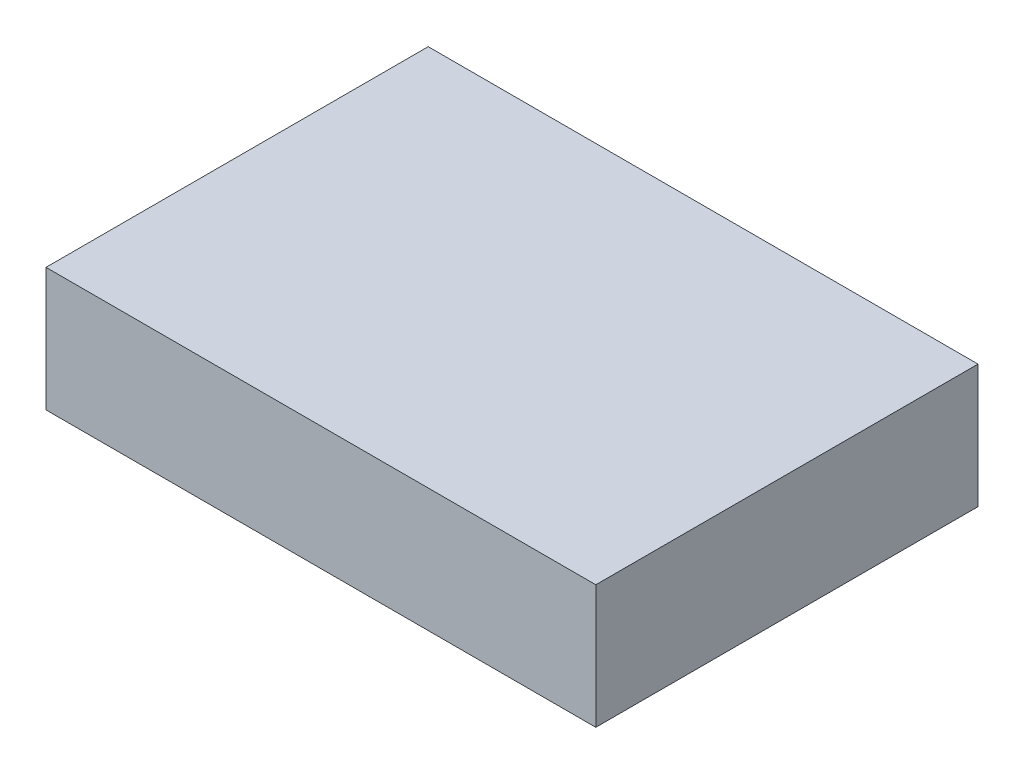
ISO-10303-21;
HEADER;
FILE_DESCRIPTION(('STEP AP214'),'2;1');
FILE_NAME('part.step','',(''),(''),'','','');
FILE_SCHEMA(('AUTOMOTIVE_DESIGN { 1 0 10303 214 1 1 1 1 }'));
ENDSEC;
DATA;
#1=APPLICATION_CONTEXT('core data for automotive mechanical design processes');
#2=APPLICATION_PROTOCOL_DEFINITION('international standard','automotive_design',2000,#1);
#3=PRODUCT_CONTEXT('',#1,'mechanical');
#4=PRODUCT('Part','Part','',(#3));
#5=PRODUCT_RELATED_PRODUCT_CATEGORY('part','',(#4));
#6=PRODUCT_DEFINITION_FORMATION('','',#4);
#7=PRODUCT_DEFINITION_CONTEXT('part definition',#1,'design');
#8=PRODUCT_DEFINITION('design','',#6,#7);
#9=PRODUCT_DEFINITION_SHAPE('','',#8);
#10=(LENGTH_UNIT() NAMED_UNIT(*) SI_UNIT(.MILLI.,.METRE.));
#11=(NAMED_UNIT(*) PLANE_ANGLE_UNIT() SI_UNIT($,.RADIAN.));
#12=(NAMED_UNIT(*) SI_UNIT($,.STERADIAN.) SOLID_ANGLE_UNIT());
#13=UNCERTAINTY_MEASURE_WITH_UNIT(LENGTH_MEASURE(1.E-05),#10,'distance_accuracy_value','');
#14=(GEOMETRIC_REPRESENTATION_CONTEXT(3) GLOBAL_UNCERTAINTY_ASSIGNED_CONTEXT((#13)) GLOBAL_UNIT_ASSIGNED_CONTEXT((#10,
#11,#12)) REPRESENTATION_CONTEXT('',''));
#15=CARTESIAN_POINT('',(0.,0.,0.));
#16=DIRECTION('',(0.,0.,1.));
#17=DIRECTION('',(1.,0.,0.));
#18=AXIS2_PLACEMENT_3D('',#15,#16,#17);
#19=CARTESIAN_POINT('',(467.5,-210.,1.1327982892113E-13));
#20=DIRECTION('',(1.,0.,0.));
#21=DIRECTION('',(0.,0.,-1.));
#22=AXIS2_PLACEMENT_3D('',#19,#20,#21);
#23=PLANE('',#22);
#24=DIRECTION('',(0.,0.,-1.));
#25=VECTOR('',#24,1.);
#26=CARTESIAN_POINT('',(467.5,0.,1.1327982892113E-13));
#27=LINE('',#26,#25);
#28=CARTESIAN_POINT('',(467.5,0.,1.1327982892113E-13));
#29=VERTEX_POINT('',#28);
#30=CARTESIAN_POINT('',(467.5,0.,-650.));
#31=VERTEX_POINT('',#30);
#32=EDGE_CURVE('E99',#29,#31,#27,.T.);
#33=ORIENTED_EDGE('',*,*,#32,.F.);
#34=DIRECTION('',(0.,1.,0.));
#35=VECTOR('',#34,1.);
#36=CARTESIAN_POINT('',(467.5,-210.,1.1327982892113E-13));
#37=LINE('',#36,#35);
#38=CARTESIAN_POINT('',(467.5,-210.,1.1327982892113E-13));
#39=VERTEX_POINT('',#38);
#40=EDGE_CURVE('E11',#39,#29,#37,.T.);
#41=ORIENTED_EDGE('',*,*,#40,.F.);
#42=DIRECTION('',(0.,0.,-1.));
#43=VECTOR('',#42,1.);
#44=CARTESIAN_POINT('',(467.5,-210.,1.1327982892113E-13));
#45=LINE('',#44,#43);
#46=CARTESIAN_POINT('',(467.5,-210.,-650.));
#47=VERTEX_POINT('',#46);
#48=EDGE_CURVE('E93',#39,#47,#45,.T.);
#49=ORIENTED_EDGE('',*,*,#48,.T.);
#50=DIRECTION('',(0.,1.,0.));
#51=VECTOR('',#50,1.);
#52=CARTESIAN_POINT('',(467.5,-210.,-650.));
#53=LINE('',#52,#51);
#54=EDGE_CURVE('E38',#47,#31,#53,.T.);
#55=ORIENTED_EDGE('',*,*,#54,.T.);
#56=EDGE_LOOP('',(#33,#41,#49,#55));
#57=FACE_BOUND('',#56,.T.);
#58=ADVANCED_FACE('F35',(#57),#23,.T.);
#59=CARTESIAN_POINT('',(467.5,-210.,1.1327982892113E-13));
#60=DIRECTION('',(0.,0.,1.));
#61=DIRECTION('',(1.,0.,0.));
#62=AXIS2_PLACEMENT_3D('',#59,#60,#61);
#63=PLANE('',#62);
#64=DIRECTION('',(1.,0.,0.));
#65=VECTOR('',#64,1.);
#66=CARTESIAN_POINT('',(467.5,0.,1.1327982892113E-13));
#67=LINE('',#66,#65);
#68=CARTESIAN_POINT('',(-467.5,0.,1.1327982892113E-13));
#69=VERTEX_POINT('',#68);
#70=EDGE_CURVE('E95',#69,#29,#67,.T.);
#71=ORIENTED_EDGE('',*,*,#70,.F.);
#72=DIRECTION('',(0.,1.,0.));
#73=VECTOR('',#72,1.);
#74=CARTESIAN_POINT('',(-467.5,-210.,1.1327982892113E-13));
#75=LINE('',#74,#73);
#76=CARTESIAN_POINT('',(-467.5,-210.,1.1327982892113E-13));
#77=VERTEX_POINT('',#76);
#78=EDGE_CURVE('E44',#77,#69,#75,.T.);
#79=ORIENTED_EDGE('',*,*,#78,.F.);
#80=DIRECTION('',(1.,0.,0.));
#81=VECTOR('',#80,1.);
#82=CARTESIAN_POINT('',(467.5,-210.,1.1327982892113E-13));
#83=LINE('',#82,#81);
#84=EDGE_CURVE('E90',#77,#39,#83,.T.);
#85=ORIENTED_EDGE('',*,*,#84,.T.);
#86=ORIENTED_EDGE('',*,*,#40,.T.);
#87=EDGE_LOOP('',(#71,#79,#85,#86));
#88=FACE_BOUND('',#87,.T.);
#89=ADVANCED_FACE('F109',(#88),#63,.T.);
#90=CARTESIAN_POINT('',(-467.5,-210.,1.1327982892113E-13));
#91=DIRECTION('',(-1.,0.,0.));
#92=DIRECTION('',(0.,0.,1.));
#93=AXIS2_PLACEMENT_3D('',#90,#91,#92);
#94=PLANE('',#93);
#95=DIRECTION('',(0.,0.,1.));
#96=VECTOR('',#95,1.);
#97=CARTESIAN_POINT('',(-467.5,0.,1.1327982892113E-13));
#98=LINE('',#97,#96);
#99=CARTESIAN_POINT('',(-467.5,0.,-650.));
#100=VERTEX_POINT('',#99);
#101=EDGE_CURVE('E85',#100,#69,#98,.T.);
#102=ORIENTED_EDGE('',*,*,#101,.F.);
#103=DIRECTION('',(0.,1.,0.));
#104=VECTOR('',#103,1.);
#105=CARTESIAN_POINT('',(-467.5,-210.,-650.));
#106=LINE('',#105,#104);
#107=CARTESIAN_POINT('',(-467.5,-210.,-650.));
#108=VERTEX_POINT('',#107);
#109=EDGE_CURVE('E80',#108,#100,#106,.T.);
#110=ORIENTED_EDGE('',*,*,#109,.F.);
#111=DIRECTION('',(0.,0.,1.));
#112=VECTOR('',#111,1.);
#113=CARTESIAN_POINT('',(-467.5,-210.,1.1327982892113E-13));
#114=LINE('',#113,#112);
#115=EDGE_CURVE('E83',#108,#77,#114,.T.);
#116=ORIENTED_EDGE('',*,*,#115,.T.);
#117=ORIENTED_EDGE('',*,*,#78,.T.);
#118=EDGE_LOOP('',(#102,#110,#116,#117));
#119=FACE_BOUND('',#118,.T.);
#120=ADVANCED_FACE('F82',(#119),#94,.T.);
#121=CARTESIAN_POINT('',(467.5,-210.,-650.));
#122=DIRECTION('',(0.,0.,-1.));
#123=DIRECTION('',(-1.,0.,0.));
#124=AXIS2_PLACEMENT_3D('',#121,#122,#123);
#125=PLANE('',#124);
#126=DIRECTION('',(-1.,0.,0.));
#127=VECTOR('',#126,1.);
#128=CARTESIAN_POINT('',(467.5,0.,-650.));
#129=LINE('',#128,#127);
#130=EDGE_CURVE('E102',#31,#100,#129,.T.);
#131=ORIENTED_EDGE('',*,*,#130,.F.);
#132=ORIENTED_EDGE('',*,*,#54,.F.);
#133=DIRECTION('',(-1.,0.,0.));
#134=VECTOR('',#133,1.);
#135=CARTESIAN_POINT('',(467.5,-210.,-650.));
#136=LINE('',#135,#134);
#137=EDGE_CURVE('E89',#47,#108,#136,.T.);
#138=ORIENTED_EDGE('',*,*,#137,.T.);
#139=ORIENTED_EDGE('',*,*,#109,.T.);
#140=EDGE_LOOP('',(#131,#132,#138,#139));
#141=FACE_BOUND('',#140,.T.);
#142=ADVANCED_FACE('F92',(#141),#125,.T.);
#143=CARTESIAN_POINT('',(0.,-210.,0.));
#144=DIRECTION('',(0.,1.,0.));
#145=DIRECTION('',(0.,0.,1.));
#146=AXIS2_PLACEMENT_3D('',#143,#144,#145);
#147=PLANE('',#146);
#148=ORIENTED_EDGE('',*,*,#48,.F.);
#149=ORIENTED_EDGE('',*,*,#84,.F.);
#150=ORIENTED_EDGE('',*,*,#115,.F.);
#151=ORIENTED_EDGE('',*,*,#137,.F.);
#152=EDGE_LOOP('',(#148,#149,#150,#151));
#153=FACE_BOUND('',#152,.T.);
#154=ADVANCED_FACE('F88',(#153),#147,.F.);
#155=CARTESIAN_POINT('',(0.,0.,0.));
#156=DIRECTION('',(0.,1.,0.));
#157=DIRECTION('',(0.,0.,1.));
#158=AXIS2_PLACEMENT_3D('',#155,#156,#157);
#159=PLANE('',#158);
#160=ORIENTED_EDGE('',*,*,#32,.T.);
#161=ORIENTED_EDGE('',*,*,#130,.T.);
#162=ORIENTED_EDGE('',*,*,#101,.T.);
#163=ORIENTED_EDGE('',*,*,#70,.T.);
#164=EDGE_LOOP('',(#160,#161,#162,#163));
#165=FACE_BOUND('',#164,.T.);
#166=ADVANCED_FACE('F108',(#165),#159,.T.);
#167=CLOSED_SHELL('',(#58,#89,#120,#142,#154,#166));
#168=MANIFOLD_SOLID_BREP('B2',#167);
#169=ADVANCED_BREP_SHAPE_REPRESENTATION('',(#18,#168),#14);
#170=SHAPE_DEFINITION_REPRESENTATION(#9,#169);
ENDSEC;
END-ISO-10303-21;
